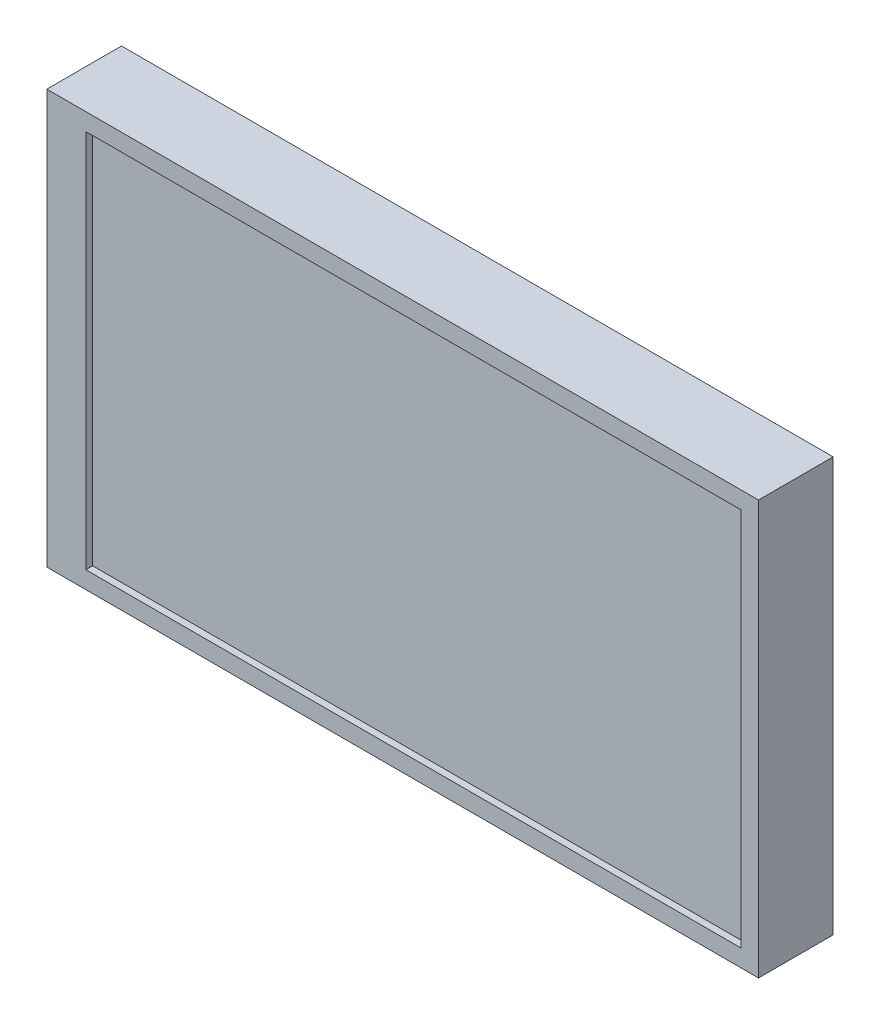
ISO-10303-21;
HEADER;
FILE_DESCRIPTION(('STEP AP214'),'2;1');
FILE_NAME('part.step','',(''),(''),'','','');
FILE_SCHEMA(('AUTOMOTIVE_DESIGN { 1 0 10303 214 1 1 1 1 }'));
ENDSEC;
DATA;
#1=APPLICATION_CONTEXT('core data for automotive mechanical design processes');
#2=APPLICATION_PROTOCOL_DEFINITION('international standard','automotive_design',2000,#1);
#3=PRODUCT_CONTEXT('',#1,'mechanical');
#4=PRODUCT('Part','Part','',(#3));
#5=PRODUCT_RELATED_PRODUCT_CATEGORY('part','',(#4));
#6=PRODUCT_DEFINITION_FORMATION('','',#4);
#7=PRODUCT_DEFINITION_CONTEXT('part definition',#1,'design');
#8=PRODUCT_DEFINITION('design','',#6,#7);
#9=PRODUCT_DEFINITION_SHAPE('','',#8);
#10=(LENGTH_UNIT() NAMED_UNIT(*) SI_UNIT(.MILLI.,.METRE.));
#11=(NAMED_UNIT(*) PLANE_ANGLE_UNIT() SI_UNIT($,.RADIAN.));
#12=(NAMED_UNIT(*) SI_UNIT($,.STERADIAN.) SOLID_ANGLE_UNIT());
#13=UNCERTAINTY_MEASURE_WITH_UNIT(LENGTH_MEASURE(1.E-05),#10,'distance_accuracy_value','');
#14=(GEOMETRIC_REPRESENTATION_CONTEXT(3) GLOBAL_UNCERTAINTY_ASSIGNED_CONTEXT((#13)) GLOBAL_UNIT_ASSIGNED_CONTEXT((#10,
#11,#12)) REPRESENTATION_CONTEXT('',''));
#15=CARTESIAN_POINT('',(0.,0.,0.));
#16=DIRECTION('',(0.,0.,1.));
#17=DIRECTION('',(1.,0.,0.));
#18=AXIS2_PLACEMENT_3D('',#15,#16,#17);
#19=CARTESIAN_POINT('',(254.,-152.4,55.));
#20=DIRECTION('',(-1.,0.,0.));
#21=DIRECTION('',(0.,0.,1.));
#22=AXIS2_PLACEMENT_3D('',#19,#20,#21);
#23=PLANE('',#22);
#24=DIRECTION('',(0.,1.,0.));
#25=VECTOR('',#24,1.);
#26=CARTESIAN_POINT('',(254.,-152.4,0.));
#27=LINE('',#26,#25);
#28=CARTESIAN_POINT('',(254.,-152.4,0.));
#29=VERTEX_POINT('',#28);
#30=CARTESIAN_POINT('',(254.,152.4,0.));
#31=VERTEX_POINT('',#30);
#32=EDGE_CURVE('E101',#29,#31,#27,.T.);
#33=ORIENTED_EDGE('',*,*,#32,.T.);
#34=DIRECTION('',(0.,0.,-1.));
#35=VECTOR('',#34,1.);
#36=CARTESIAN_POINT('',(254.,152.4,55.));
#37=LINE('',#36,#35);
#38=CARTESIAN_POINT('',(254.,152.4,55.));
#39=VERTEX_POINT('',#38);
#40=EDGE_CURVE('E11',#39,#31,#37,.T.);
#41=ORIENTED_EDGE('',*,*,#40,.F.);
#42=DIRECTION('',(0.,1.,0.));
#43=VECTOR('',#42,1.);
#44=CARTESIAN_POINT('',(254.,-152.4,55.));
#45=LINE('',#44,#43);
#46=CARTESIAN_POINT('',(254.,-152.4,55.));
#47=VERTEX_POINT('',#46);
#48=EDGE_CURVE('E95',#47,#39,#45,.T.);
#49=ORIENTED_EDGE('',*,*,#48,.F.);
#50=DIRECTION('',(0.,0.,-1.));
#51=VECTOR('',#50,1.);
#52=CARTESIAN_POINT('',(254.,-152.4,55.));
#53=LINE('',#52,#51);
#54=EDGE_CURVE('E53',#47,#29,#53,.T.);
#55=ORIENTED_EDGE('',*,*,#54,.T.);
#56=EDGE_LOOP('',(#33,#41,#49,#55));
#57=FACE_BOUND('',#56,.T.);
#58=ADVANCED_FACE('F45',(#57),#23,.F.);
#59=CARTESIAN_POINT('',(-254.,152.4,55.));
#60=DIRECTION('',(0.,-1.,0.));
#61=DIRECTION('',(0.,0.,-1.));
#62=AXIS2_PLACEMENT_3D('',#59,#60,#61);
#63=PLANE('',#62);
#64=DIRECTION('',(-1.,0.,0.));
#65=VECTOR('',#64,1.);
#66=CARTESIAN_POINT('',(-254.,152.4,0.));
#67=LINE('',#66,#65);
#68=CARTESIAN_POINT('',(-270.,152.4,0.));
#69=VERTEX_POINT('',#68);
#70=EDGE_CURVE('E96',#31,#69,#67,.T.);
#71=ORIENTED_EDGE('',*,*,#70,.T.);
#72=DIRECTION('',(0.,0.,-1.));
#73=VECTOR('',#72,1.);
#74=CARTESIAN_POINT('',(-270.,152.4,55.));
#75=LINE('',#74,#73);
#76=CARTESIAN_POINT('',(-270.,152.4,55.));
#77=VERTEX_POINT('',#76);
#78=EDGE_CURVE('E203',#77,#69,#75,.T.);
#79=ORIENTED_EDGE('',*,*,#78,.F.);
#80=DIRECTION('',(-1.,0.,0.));
#81=VECTOR('',#80,1.);
#82=CARTESIAN_POINT('',(-254.,152.4,55.));
#83=LINE('',#82,#81);
#84=EDGE_CURVE('E117',#39,#77,#83,.T.);
#85=ORIENTED_EDGE('',*,*,#84,.F.);
#86=ORIENTED_EDGE('',*,*,#40,.T.);
#87=EDGE_LOOP('',(#71,#79,#85,#86));
#88=FACE_BOUND('',#87,.T.);
#89=ADVANCED_FACE('F213',(#88),#63,.F.);
#90=CARTESIAN_POINT('',(-254.,-152.4,55.));
#91=DIRECTION('',(0.,1.,0.));
#92=DIRECTION('',(0.,0.,1.));
#93=AXIS2_PLACEMENT_3D('',#90,#91,#92);
#94=PLANE('',#93);
#95=DIRECTION('',(1.,0.,0.));
#96=VECTOR('',#95,1.);
#97=CARTESIAN_POINT('',(-254.,-152.4,0.));
#98=LINE('',#97,#96);
#99=CARTESIAN_POINT('',(-270.,-152.4,0.));
#100=VERTEX_POINT('',#99);
#101=EDGE_CURVE('E83',#100,#29,#98,.T.);
#102=ORIENTED_EDGE('',*,*,#101,.T.);
#103=ORIENTED_EDGE('',*,*,#54,.F.);
#104=DIRECTION('',(1.,0.,0.));
#105=VECTOR('',#104,1.);
#106=CARTESIAN_POINT('',(-254.,-152.4,55.));
#107=LINE('',#106,#105);
#108=CARTESIAN_POINT('',(-270.,-152.4,55.));
#109=VERTEX_POINT('',#108);
#110=EDGE_CURVE('E69',#109,#47,#107,.T.);
#111=ORIENTED_EDGE('',*,*,#110,.F.);
#112=DIRECTION('',(0.,0.,1.));
#113=VECTOR('',#112,1.);
#114=CARTESIAN_POINT('',(-270.,-152.4,0.));
#115=LINE('',#114,#113);
#116=EDGE_CURVE('E89',#100,#109,#115,.T.);
#117=ORIENTED_EDGE('',*,*,#116,.F.);
#118=EDGE_LOOP('',(#102,#103,#111,#117));
#119=FACE_BOUND('',#118,.T.);
#120=ADVANCED_FACE('F85',(#119),#94,.F.);
#121=CARTESIAN_POINT('',(0.,0.,55.));
#122=DIRECTION('',(0.,0.,-1.));
#123=DIRECTION('',(-1.,0.,0.));
#124=AXIS2_PLACEMENT_3D('',#121,#122,#123);
#125=PLANE('',#124);
#126=DIRECTION('',(-1.,0.,0.));
#127=VECTOR('',#126,1.);
#128=CARTESIAN_POINT('',(-241.3,139.7,55.));
#129=LINE('',#128,#127);
#130=CARTESIAN_POINT('',(241.3,139.7,55.));
#131=VERTEX_POINT('',#130);
#132=CARTESIAN_POINT('',(-241.3,139.7,55.));
#133=VERTEX_POINT('',#132);
#134=EDGE_CURVE('E174',#131,#133,#129,.T.);
#135=ORIENTED_EDGE('',*,*,#134,.F.);
#136=DIRECTION('',(0.,1.,0.));
#137=VECTOR('',#136,1.);
#138=CARTESIAN_POINT('',(241.3,-139.7,55.));
#139=LINE('',#138,#137);
#140=CARTESIAN_POINT('',(241.3,-139.7,55.));
#141=VERTEX_POINT('',#140);
#142=EDGE_CURVE('E60',#141,#131,#139,.T.);
#143=ORIENTED_EDGE('',*,*,#142,.F.);
#144=DIRECTION('',(1.,0.,0.));
#145=VECTOR('',#144,1.);
#146=CARTESIAN_POINT('',(-241.3,-139.7,55.));
#147=LINE('',#146,#145);
#148=CARTESIAN_POINT('',(-241.3,-139.7,55.));
#149=VERTEX_POINT('',#148);
#150=EDGE_CURVE('E165',#149,#141,#147,.T.);
#151=ORIENTED_EDGE('',*,*,#150,.F.);
#152=DIRECTION('',(0.,-1.,0.));
#153=VECTOR('',#152,1.);
#154=CARTESIAN_POINT('',(-241.3,-139.7,55.));
#155=LINE('',#154,#153);
#156=EDGE_CURVE('E170',#133,#149,#155,.T.);
#157=ORIENTED_EDGE('',*,*,#156,.F.);
#158=EDGE_LOOP('',(#135,#143,#151,#157));
#159=FACE_BOUND('',#158,.T.);
#160=ORIENTED_EDGE('',*,*,#48,.T.);
#161=ORIENTED_EDGE('',*,*,#84,.T.);
#162=DIRECTION('',(0.,1.,0.));
#163=VECTOR('',#162,1.);
#164=CARTESIAN_POINT('',(-270.,-152.4,55.));
#165=LINE('',#164,#163);
#166=EDGE_CURVE('E180',#109,#77,#165,.T.);
#167=ORIENTED_EDGE('',*,*,#166,.F.);
#168=ORIENTED_EDGE('',*,*,#110,.T.);
#169=EDGE_LOOP('',(#160,#161,#167,#168));
#170=FACE_BOUND('',#169,.T.);
#171=ADVANCED_FACE('F260',(#159,#170),#125,.F.);
#172=CARTESIAN_POINT('',(0.,0.,0.));
#173=DIRECTION('',(0.,0.,-1.));
#174=DIRECTION('',(-1.,0.,0.));
#175=AXIS2_PLACEMENT_3D('',#172,#173,#174);
#176=PLANE('',#175);
#177=CARTESIAN_POINT('',(-50.,50.,0.));
#178=DIRECTION('',(0.,0.,-1.));
#179=DIRECTION('',(-1.,0.,0.));
#180=AXIS2_PLACEMENT_3D('',#177,#178,#179);
#181=CIRCLE('',#180,2.49999999999999);
#182=CARTESIAN_POINT('',(-52.5,50.,0.));
#183=VERTEX_POINT('',#182);
#184=EDGE_CURVE('E146',#183,#183,#181,.T.);
#185=ORIENTED_EDGE('',*,*,#184,.F.);
#186=EDGE_LOOP('',(#185));
#187=FACE_BOUND('',#186,.T.);
#188=CARTESIAN_POINT('',(50.,-50.,0.));
#189=DIRECTION('',(0.,0.,-1.));
#190=DIRECTION('',(-1.,0.,0.));
#191=AXIS2_PLACEMENT_3D('',#188,#189,#190);
#192=CIRCLE('',#191,2.49999999999999);
#193=CARTESIAN_POINT('',(47.5,-50.,0.));
#194=VERTEX_POINT('',#193);
#195=EDGE_CURVE('E138',#194,#194,#192,.T.);
#196=ORIENTED_EDGE('',*,*,#195,.F.);
#197=EDGE_LOOP('',(#196));
#198=FACE_BOUND('',#197,.T.);
#199=CARTESIAN_POINT('',(50.,50.,0.));
#200=DIRECTION('',(0.,0.,-1.));
#201=DIRECTION('',(-1.,0.,0.));
#202=AXIS2_PLACEMENT_3D('',#199,#200,#201);
#203=CIRCLE('',#202,2.49999999999999);
#204=CARTESIAN_POINT('',(47.5,50.,0.));
#205=VERTEX_POINT('',#204);
#206=EDGE_CURVE('E130',#205,#205,#203,.T.);
#207=ORIENTED_EDGE('',*,*,#206,.F.);
#208=EDGE_LOOP('',(#207));
#209=FACE_BOUND('',#208,.T.);
#210=CARTESIAN_POINT('',(-50.,-50.,0.));
#211=DIRECTION('',(0.,0.,-1.));
#212=DIRECTION('',(-1.,0.,0.));
#213=AXIS2_PLACEMENT_3D('',#210,#211,#212);
#214=CIRCLE('',#213,2.49999999999999);
#215=CARTESIAN_POINT('',(-52.5,-50.,0.));
#216=VERTEX_POINT('',#215);
#217=EDGE_CURVE('E112',#216,#216,#214,.T.);
#218=ORIENTED_EDGE('',*,*,#217,.F.);
#219=EDGE_LOOP('',(#218));
#220=FACE_BOUND('',#219,.T.);
#221=ORIENTED_EDGE('',*,*,#32,.F.);
#222=ORIENTED_EDGE('',*,*,#101,.F.);
#223=DIRECTION('',(0.,-1.,0.));
#224=VECTOR('',#223,1.);
#225=CARTESIAN_POINT('',(-270.,152.4,0.));
#226=LINE('',#225,#224);
#227=EDGE_CURVE('E200',#69,#100,#226,.T.);
#228=ORIENTED_EDGE('',*,*,#227,.F.);
#229=ORIENTED_EDGE('',*,*,#70,.F.);
#230=EDGE_LOOP('',(#221,#222,#228,#229));
#231=FACE_BOUND('',#230,.T.);
#232=ADVANCED_FACE('F103',(#187,#198,#209,#220,#231),#176,.T.);
#233=CARTESIAN_POINT('',(-50.,-50.,17.));
#234=DIRECTION('',(0.,0.,-1.));
#235=DIRECTION('',(-1.,0.,0.));
#236=AXIS2_PLACEMENT_3D('',#233,#234,#235);
#237=CONICAL_SURFACE('',#236,2.49999999999999,1.02974425867665);
#238=CARTESIAN_POINT('',(-50.,-50.,18.5021515475689));
#239=VERTEX_POINT('',#238);
#240=VERTEX_LOOP('',#239);
#241=FACE_BOUND('',#240,.T.);
#242=CARTESIAN_POINT('',(-50.,-50.,17.));
#243=DIRECTION('',(0.,0.,-1.));
#244=DIRECTION('',(-1.,0.,0.));
#245=AXIS2_PLACEMENT_3D('',#242,#243,#244);
#246=CIRCLE('',#245,2.49999999999999);
#247=CARTESIAN_POINT('',(-52.5,-50.,17.));
#248=VERTEX_POINT('',#247);
#249=EDGE_CURVE('E106',#248,#248,#246,.T.);
#250=ORIENTED_EDGE('',*,*,#249,.T.);
#251=EDGE_LOOP('',(#250));
#252=FACE_BOUND('',#251,.T.);
#253=ADVANCED_FACE('F246',(#241,#252),#237,.F.);
#254=CARTESIAN_POINT('',(-50.,-50.,0.));
#255=DIRECTION('',(0.,0.,-1.));
#256=DIRECTION('',(-1.,0.,0.));
#257=AXIS2_PLACEMENT_3D('',#254,#255,#256);
#258=CYLINDRICAL_SURFACE('',#257,2.49999999999999);
#259=ORIENTED_EDGE('',*,*,#249,.F.);
#260=EDGE_LOOP('',(#259));
#261=FACE_BOUND('',#260,.T.);
#262=ORIENTED_EDGE('',*,*,#217,.T.);
#263=EDGE_LOOP('',(#262));
#264=FACE_BOUND('',#263,.T.);
#265=ADVANCED_FACE('F249',(#261,#264),#258,.F.);
#266=CARTESIAN_POINT('',(50.,50.,17.));
#267=DIRECTION('',(0.,0.,-1.));
#268=DIRECTION('',(-1.,0.,0.));
#269=AXIS2_PLACEMENT_3D('',#266,#267,#268);
#270=CONICAL_SURFACE('',#269,2.49999999999999,1.02974425867665);
#271=CARTESIAN_POINT('',(50.,50.,18.5021515475689));
#272=VERTEX_POINT('',#271);
#273=VERTEX_LOOP('',#272);
#274=FACE_BOUND('',#273,.T.);
#275=CARTESIAN_POINT('',(50.,50.,17.));
#276=DIRECTION('',(0.,0.,-1.));
#277=DIRECTION('',(-1.,0.,0.));
#278=AXIS2_PLACEMENT_3D('',#275,#276,#277);
#279=CIRCLE('',#278,2.49999999999999);
#280=CARTESIAN_POINT('',(47.5,50.,17.));
#281=VERTEX_POINT('',#280);
#282=EDGE_CURVE('E126',#281,#281,#279,.T.);
#283=ORIENTED_EDGE('',*,*,#282,.T.);
#284=EDGE_LOOP('',(#283));
#285=FACE_BOUND('',#284,.T.);
#286=ADVANCED_FACE('F255',(#274,#285),#270,.F.);
#287=CARTESIAN_POINT('',(50.,50.,0.));
#288=DIRECTION('',(0.,0.,-1.));
#289=DIRECTION('',(-1.,0.,0.));
#290=AXIS2_PLACEMENT_3D('',#287,#288,#289);
#291=CYLINDRICAL_SURFACE('',#290,2.49999999999999);
#292=ORIENTED_EDGE('',*,*,#282,.F.);
#293=EDGE_LOOP('',(#292));
#294=FACE_BOUND('',#293,.T.);
#295=ORIENTED_EDGE('',*,*,#206,.T.);
#296=EDGE_LOOP('',(#295));
#297=FACE_BOUND('',#296,.T.);
#298=ADVANCED_FACE('F337',(#294,#297),#291,.F.);
#299=CARTESIAN_POINT('',(50.,-50.,17.));
#300=DIRECTION('',(0.,0.,-1.));
#301=DIRECTION('',(-1.,0.,0.));
#302=AXIS2_PLACEMENT_3D('',#299,#300,#301);
#303=CONICAL_SURFACE('',#302,2.49999999999999,1.02974425867665);
#304=CARTESIAN_POINT('',(50.,-50.,18.5021515475689));
#305=VERTEX_POINT('',#304);
#306=VERTEX_LOOP('',#305);
#307=FACE_BOUND('',#306,.T.);
#308=CARTESIAN_POINT('',(50.,-50.,17.));
#309=DIRECTION('',(0.,0.,-1.));
#310=DIRECTION('',(-1.,0.,0.));
#311=AXIS2_PLACEMENT_3D('',#308,#309,#310);
#312=CIRCLE('',#311,2.49999999999999);
#313=CARTESIAN_POINT('',(47.5,-50.,17.));
#314=VERTEX_POINT('',#313);
#315=EDGE_CURVE('E134',#314,#314,#312,.T.);
#316=ORIENTED_EDGE('',*,*,#315,.T.);
#317=EDGE_LOOP('',(#316));
#318=FACE_BOUND('',#317,.T.);
#319=ADVANCED_FACE('F333',(#307,#318),#303,.F.);
#320=CARTESIAN_POINT('',(50.,-50.,0.));
#321=DIRECTION('',(0.,0.,-1.));
#322=DIRECTION('',(-1.,0.,0.));
#323=AXIS2_PLACEMENT_3D('',#320,#321,#322);
#324=CYLINDRICAL_SURFACE('',#323,2.49999999999999);
#325=ORIENTED_EDGE('',*,*,#315,.F.);
#326=EDGE_LOOP('',(#325));
#327=FACE_BOUND('',#326,.T.);
#328=ORIENTED_EDGE('',*,*,#195,.T.);
#329=EDGE_LOOP('',(#328));
#330=FACE_BOUND('',#329,.T.);
#331=ADVANCED_FACE('F329',(#327,#330),#324,.F.);
#332=CARTESIAN_POINT('',(-50.,50.,17.));
#333=DIRECTION('',(0.,0.,-1.));
#334=DIRECTION('',(-1.,0.,0.));
#335=AXIS2_PLACEMENT_3D('',#332,#333,#334);
#336=CONICAL_SURFACE('',#335,2.49999999999999,1.02974425867665);
#337=CARTESIAN_POINT('',(-50.,50.,18.5021515475689));
#338=VERTEX_POINT('',#337);
#339=VERTEX_LOOP('',#338);
#340=FACE_BOUND('',#339,.T.);
#341=CARTESIAN_POINT('',(-50.,50.,17.));
#342=DIRECTION('',(0.,0.,-1.));
#343=DIRECTION('',(-1.,0.,0.));
#344=AXIS2_PLACEMENT_3D('',#341,#342,#343);
#345=CIRCLE('',#344,2.49999999999999);
#346=CARTESIAN_POINT('',(-52.5,50.,17.));
#347=VERTEX_POINT('',#346);
#348=EDGE_CURVE('E142',#347,#347,#345,.T.);
#349=ORIENTED_EDGE('',*,*,#348,.T.);
#350=EDGE_LOOP('',(#349));
#351=FACE_BOUND('',#350,.T.);
#352=ADVANCED_FACE('F325',(#340,#351),#336,.F.);
#353=CARTESIAN_POINT('',(-50.,50.,0.));
#354=DIRECTION('',(0.,0.,-1.));
#355=DIRECTION('',(-1.,0.,0.));
#356=AXIS2_PLACEMENT_3D('',#353,#354,#355);
#357=CYLINDRICAL_SURFACE('',#356,2.49999999999999);
#358=ORIENTED_EDGE('',*,*,#348,.F.);
#359=EDGE_LOOP('',(#358));
#360=FACE_BOUND('',#359,.T.);
#361=ORIENTED_EDGE('',*,*,#184,.T.);
#362=EDGE_LOOP('',(#361));
#363=FACE_BOUND('',#362,.T.);
#364=ADVANCED_FACE('F322',(#360,#363),#357,.F.);
#365=CARTESIAN_POINT('',(241.3,-139.7,50.));
#366=DIRECTION('',(1.,0.,0.));
#367=DIRECTION('',(0.,0.,-1.));
#368=AXIS2_PLACEMENT_3D('',#365,#366,#367);
#369=PLANE('',#368);
#370=ORIENTED_EDGE('',*,*,#142,.T.);
#371=DIRECTION('',(0.,0.,1.));
#372=VECTOR('',#371,1.);
#373=CARTESIAN_POINT('',(241.3,139.7,50.));
#374=LINE('',#373,#372);
#375=CARTESIAN_POINT('',(241.3,139.7,50.));
#376=VERTEX_POINT('',#375);
#377=EDGE_CURVE('E151',#376,#131,#374,.T.);
#378=ORIENTED_EDGE('',*,*,#377,.F.);
#379=DIRECTION('',(0.,1.,0.));
#380=VECTOR('',#379,1.);
#381=CARTESIAN_POINT('',(241.3,-139.7,50.));
#382=LINE('',#381,#380);
#383=CARTESIAN_POINT('',(241.3,-139.7,50.));
#384=VERTEX_POINT('',#383);
#385=EDGE_CURVE('E169',#384,#376,#382,.T.);
#386=ORIENTED_EDGE('',*,*,#385,.F.);
#387=DIRECTION('',(0.,0.,1.));
#388=VECTOR('',#387,1.);
#389=CARTESIAN_POINT('',(241.3,-139.7,50.));
#390=LINE('',#389,#388);
#391=EDGE_CURVE('E150',#384,#141,#390,.T.);
#392=ORIENTED_EDGE('',*,*,#391,.T.);
#393=EDGE_LOOP('',(#370,#378,#386,#392));
#394=FACE_BOUND('',#393,.T.);
#395=ADVANCED_FACE('F312',(#394),#369,.F.);
#396=CARTESIAN_POINT('',(-241.3,-139.7,50.));
#397=DIRECTION('',(0.,-1.,0.));
#398=DIRECTION('',(0.,0.,-1.));
#399=AXIS2_PLACEMENT_3D('',#396,#397,#398);
#400=PLANE('',#399);
#401=ORIENTED_EDGE('',*,*,#150,.T.);
#402=ORIENTED_EDGE('',*,*,#391,.F.);
#403=DIRECTION('',(1.,0.,0.));
#404=VECTOR('',#403,1.);
#405=CARTESIAN_POINT('',(-241.3,-139.7,50.));
#406=LINE('',#405,#404);
#407=CARTESIAN_POINT('',(-241.3,-139.7,50.));
#408=VERTEX_POINT('',#407);
#409=EDGE_CURVE('E155',#408,#384,#406,.T.);
#410=ORIENTED_EDGE('',*,*,#409,.F.);
#411=DIRECTION('',(0.,0.,1.));
#412=VECTOR('',#411,1.);
#413=CARTESIAN_POINT('',(-241.3,-139.7,50.));
#414=LINE('',#413,#412);
#415=EDGE_CURVE('E159',#408,#149,#414,.T.);
#416=ORIENTED_EDGE('',*,*,#415,.T.);
#417=EDGE_LOOP('',(#401,#402,#410,#416));
#418=FACE_BOUND('',#417,.T.);
#419=ADVANCED_FACE('F308',(#418),#400,.F.);
#420=CARTESIAN_POINT('',(-241.3,-139.7,50.));
#421=DIRECTION('',(-1.,0.,0.));
#422=DIRECTION('',(0.,0.,1.));
#423=AXIS2_PLACEMENT_3D('',#420,#421,#422);
#424=PLANE('',#423);
#425=ORIENTED_EDGE('',*,*,#156,.T.);
#426=ORIENTED_EDGE('',*,*,#415,.F.);
#427=DIRECTION('',(0.,-1.,0.));
#428=VECTOR('',#427,1.);
#429=CARTESIAN_POINT('',(-241.3,-139.7,50.));
#430=LINE('',#429,#428);
#431=CARTESIAN_POINT('',(-241.3,139.7,50.));
#432=VERTEX_POINT('',#431);
#433=EDGE_CURVE('E184',#432,#408,#430,.T.);
#434=ORIENTED_EDGE('',*,*,#433,.F.);
#435=DIRECTION('',(0.,0.,1.));
#436=VECTOR('',#435,1.);
#437=CARTESIAN_POINT('',(-241.3,139.7,50.));
#438=LINE('',#437,#436);
#439=EDGE_CURVE('E154',#432,#133,#438,.T.);
#440=ORIENTED_EDGE('',*,*,#439,.T.);
#441=EDGE_LOOP('',(#425,#426,#434,#440));
#442=FACE_BOUND('',#441,.T.);
#443=ADVANCED_FACE('F311',(#442),#424,.F.);
#444=CARTESIAN_POINT('',(-241.3,139.7,50.));
#445=DIRECTION('',(0.,1.,0.));
#446=DIRECTION('',(0.,0.,1.));
#447=AXIS2_PLACEMENT_3D('',#444,#445,#446);
#448=PLANE('',#447);
#449=ORIENTED_EDGE('',*,*,#134,.T.);
#450=ORIENTED_EDGE('',*,*,#439,.F.);
#451=DIRECTION('',(-1.,0.,0.));
#452=VECTOR('',#451,1.);
#453=CARTESIAN_POINT('',(-241.3,139.7,50.));
#454=LINE('',#453,#452);
#455=EDGE_CURVE('E188',#376,#432,#454,.T.);
#456=ORIENTED_EDGE('',*,*,#455,.F.);
#457=ORIENTED_EDGE('',*,*,#377,.T.);
#458=EDGE_LOOP('',(#449,#450,#456,#457));
#459=FACE_BOUND('',#458,.T.);
#460=ADVANCED_FACE('F304',(#459),#448,.F.);
#461=CARTESIAN_POINT('',(0.,0.,50.));
#462=DIRECTION('',(0.,0.,-1.));
#463=DIRECTION('',(-1.,0.,0.));
#464=AXIS2_PLACEMENT_3D('',#461,#462,#463);
#465=PLANE('',#464);
#466=ORIENTED_EDGE('',*,*,#385,.T.);
#467=ORIENTED_EDGE('',*,*,#455,.T.);
#468=ORIENTED_EDGE('',*,*,#433,.T.);
#469=ORIENTED_EDGE('',*,*,#409,.T.);
#470=EDGE_LOOP('',(#466,#467,#468,#469));
#471=FACE_BOUND('',#470,.T.);
#472=ADVANCED_FACE('F299',(#471),#465,.F.);
#473=CARTESIAN_POINT('',(-270.,0.,0.));
#474=DIRECTION('',(-1.,0.,0.));
#475=DIRECTION('',(0.,0.,1.));
#476=AXIS2_PLACEMENT_3D('',#473,#474,#475);
#477=PLANE('',#476);
#478=ORIENTED_EDGE('',*,*,#78,.T.);
#479=ORIENTED_EDGE('',*,*,#227,.T.);
#480=ORIENTED_EDGE('',*,*,#116,.T.);
#481=ORIENTED_EDGE('',*,*,#166,.T.);
#482=EDGE_LOOP('',(#478,#479,#480,#481));
#483=FACE_BOUND('',#482,.T.);
#484=ADVANCED_FACE('F209',(#483),#477,.T.);
#485=CLOSED_SHELL('',(#58,#89,#120,#171,#232,#253,#265,#286,#298,#319,#331,#352,#364,#395,#419,
#443,#460,#472,#484));
#486=MANIFOLD_SOLID_BREP('B2',#485);
#487=ADVANCED_BREP_SHAPE_REPRESENTATION('',(#18,#486),#14);
#488=SHAPE_DEFINITION_REPRESENTATION(#9,#487);
ENDSEC;
END-ISO-10303-21;
